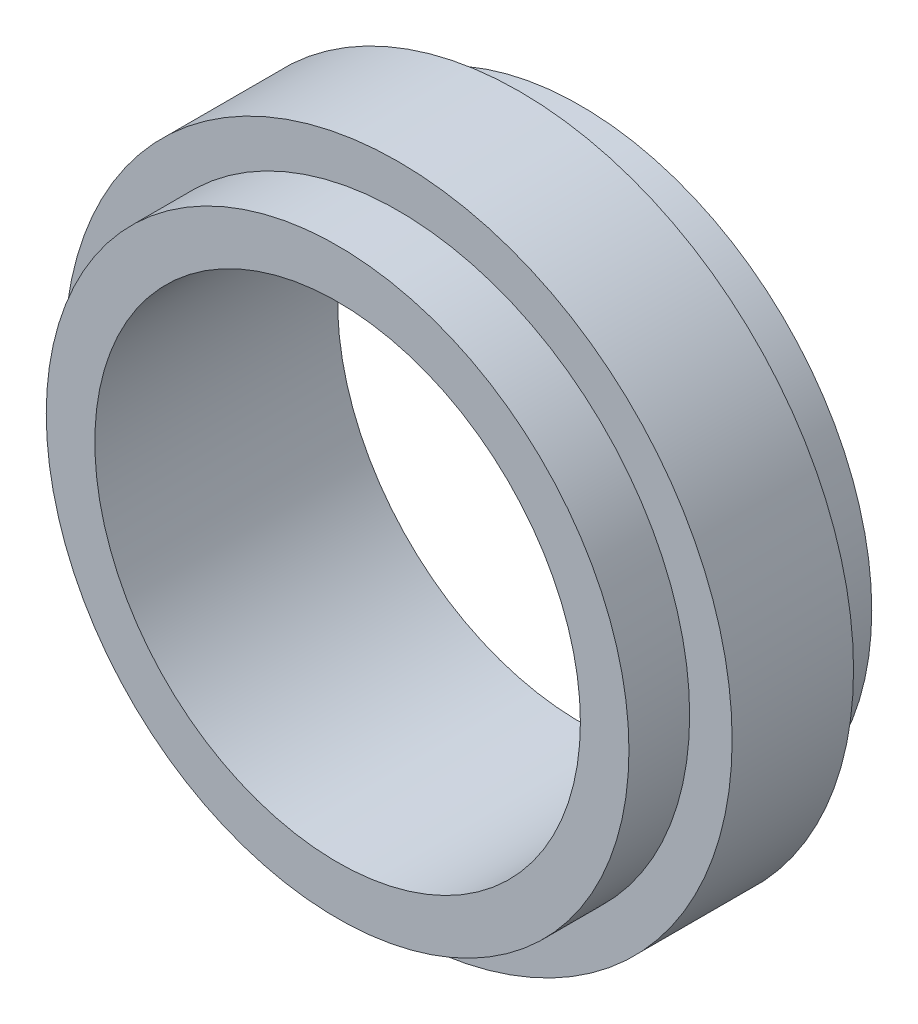
ISO-10303-21;
HEADER;
FILE_DESCRIPTION(('STEP AP214'),'2;1');
FILE_NAME('part.step','',(''),(''),'','','');
FILE_SCHEMA(('AUTOMOTIVE_DESIGN { 1 0 10303 214 1 1 1 1 }'));
ENDSEC;
DATA;
#1=APPLICATION_CONTEXT('core data for automotive mechanical design processes');
#2=APPLICATION_PROTOCOL_DEFINITION('international standard','automotive_design',2000,#1);
#3=PRODUCT_CONTEXT('',#1,'mechanical');
#4=PRODUCT('Part','Part','',(#3));
#5=PRODUCT_RELATED_PRODUCT_CATEGORY('part','',(#4));
#6=PRODUCT_DEFINITION_FORMATION('','',#4);
#7=PRODUCT_DEFINITION_CONTEXT('part definition',#1,'design');
#8=PRODUCT_DEFINITION('design','',#6,#7);
#9=PRODUCT_DEFINITION_SHAPE('','',#8);
#10=(LENGTH_UNIT() NAMED_UNIT(*) SI_UNIT(.MILLI.,.METRE.));
#11=(NAMED_UNIT(*) PLANE_ANGLE_UNIT() SI_UNIT($,.RADIAN.));
#12=(NAMED_UNIT(*) SI_UNIT($,.STERADIAN.) SOLID_ANGLE_UNIT());
#13=UNCERTAINTY_MEASURE_WITH_UNIT(LENGTH_MEASURE(1.E-05),#10,'distance_accuracy_value','');
#14=(GEOMETRIC_REPRESENTATION_CONTEXT(3) GLOBAL_UNCERTAINTY_ASSIGNED_CONTEXT((#13)) GLOBAL_UNIT_ASSIGNED_CONTEXT((#10,
#11,#12)) REPRESENTATION_CONTEXT('',''));
#15=CARTESIAN_POINT('',(0.,0.,0.));
#16=DIRECTION('',(0.,0.,1.));
#17=DIRECTION('',(1.,0.,0.));
#18=AXIS2_PLACEMENT_3D('',#15,#16,#17);
#19=CARTESIAN_POINT('',(0.,0.,5.));
#20=DIRECTION('',(0.,0.,1.));
#21=DIRECTION('',(1.,0.,0.));
#22=AXIS2_PLACEMENT_3D('',#19,#20,#21);
#23=PLANE('',#22);
#24=CARTESIAN_POINT('',(0.,0.,5.));
#25=DIRECTION('',(0.,0.,1.));
#26=DIRECTION('',(1.,0.,0.));
#27=AXIS2_PLACEMENT_3D('',#24,#25,#26);
#28=CIRCLE('',#27,27.5);
#29=CARTESIAN_POINT('',(27.5,0.,5.));
#30=VERTEX_POINT('',#29);
#31=EDGE_CURVE('E10',#30,#30,#28,.T.);
#32=ORIENTED_EDGE('',*,*,#31,.T.);
#33=EDGE_LOOP('',(#32));
#34=FACE_BOUND('',#33,.T.);
#35=CARTESIAN_POINT('',(0.,0.,5.));
#36=DIRECTION('',(0.,0.,1.));
#37=DIRECTION('',(1.,0.,0.));
#38=AXIS2_PLACEMENT_3D('',#35,#36,#37);
#39=CIRCLE('',#38,24.);
#40=CARTESIAN_POINT('',(24.,0.,5.));
#41=VERTEX_POINT('',#40);
#42=EDGE_CURVE('E47',#41,#41,#39,.T.);
#43=ORIENTED_EDGE('',*,*,#42,.F.);
#44=EDGE_LOOP('',(#43));
#45=FACE_BOUND('',#44,.T.);
#46=ADVANCED_FACE('F34',(#34,#45),#23,.T.);
#47=CARTESIAN_POINT('',(0.,0.,-5.));
#48=DIRECTION('',(0.,0.,1.));
#49=DIRECTION('',(1.,0.,0.));
#50=AXIS2_PLACEMENT_3D('',#47,#48,#49);
#51=PLANE('',#50);
#52=CARTESIAN_POINT('',(0.,0.,-5.));
#53=DIRECTION('',(0.,0.,1.));
#54=DIRECTION('',(1.,0.,0.));
#55=AXIS2_PLACEMENT_3D('',#52,#53,#54);
#56=CIRCLE('',#55,24.);
#57=CARTESIAN_POINT('',(24.,0.,-5.));
#58=VERTEX_POINT('',#57);
#59=EDGE_CURVE('E56',#58,#58,#56,.T.);
#60=ORIENTED_EDGE('',*,*,#59,.T.);
#61=EDGE_LOOP('',(#60));
#62=FACE_BOUND('',#61,.T.);
#63=CARTESIAN_POINT('',(0.,0.,-5.));
#64=DIRECTION('',(0.,0.,1.));
#65=DIRECTION('',(1.,0.,0.));
#66=AXIS2_PLACEMENT_3D('',#63,#64,#65);
#67=CIRCLE('',#66,27.5);
#68=CARTESIAN_POINT('',(27.5,0.,-5.));
#69=VERTEX_POINT('',#68);
#70=EDGE_CURVE('E38',#69,#69,#67,.T.);
#71=ORIENTED_EDGE('',*,*,#70,.F.);
#72=EDGE_LOOP('',(#71));
#73=FACE_BOUND('',#72,.T.);
#74=ADVANCED_FACE('F80',(#62,#73),#51,.F.);
#75=CARTESIAN_POINT('',(0.,0.,5.));
#76=DIRECTION('',(0.,0.,-1.));
#77=DIRECTION('',(-1.,0.,0.));
#78=AXIS2_PLACEMENT_3D('',#75,#76,#77);
#79=CYLINDRICAL_SURFACE('',#78,27.5);
#80=ORIENTED_EDGE('',*,*,#31,.F.);
#81=EDGE_LOOP('',(#80));
#82=FACE_BOUND('',#81,.T.);
#83=ORIENTED_EDGE('',*,*,#70,.T.);
#84=EDGE_LOOP('',(#83));
#85=FACE_BOUND('',#84,.T.);
#86=ADVANCED_FACE('F36',(#82,#85),#79,.T.);
#87=CARTESIAN_POINT('',(0.,0.,5.));
#88=DIRECTION('',(0.,0.,-1.));
#89=DIRECTION('',(-1.,0.,0.));
#90=AXIS2_PLACEMENT_3D('',#87,#88,#89);
#91=CYLINDRICAL_SURFACE('',#90,20.);
#92=CARTESIAN_POINT('',(0.,0.,10.));
#93=DIRECTION('',(0.,0.,1.));
#94=DIRECTION('',(1.,0.,0.));
#95=AXIS2_PLACEMENT_3D('',#92,#93,#94);
#96=CIRCLE('',#95,20.);
#97=CARTESIAN_POINT('',(20.,0.,10.));
#98=VERTEX_POINT('',#97);
#99=EDGE_CURVE('E50',#98,#98,#96,.T.);
#100=ORIENTED_EDGE('',*,*,#99,.T.);
#101=EDGE_LOOP('',(#100));
#102=FACE_BOUND('',#101,.T.);
#103=CARTESIAN_POINT('',(0.,0.,-10.));
#104=DIRECTION('',(0.,0.,1.));
#105=DIRECTION('',(1.,0.,0.));
#106=AXIS2_PLACEMENT_3D('',#103,#104,#105);
#107=CIRCLE('',#106,20.);
#108=CARTESIAN_POINT('',(20.,0.,-10.));
#109=VERTEX_POINT('',#108);
#110=EDGE_CURVE('E59',#109,#109,#107,.T.);
#111=ORIENTED_EDGE('',*,*,#110,.F.);
#112=EDGE_LOOP('',(#111));
#113=FACE_BOUND('',#112,.T.);
#114=ADVANCED_FACE('F68',(#102,#113),#91,.F.);
#115=CARTESIAN_POINT('',(0.,0.,10.));
#116=DIRECTION('',(0.,0.,1.));
#117=DIRECTION('',(1.,0.,0.));
#118=AXIS2_PLACEMENT_3D('',#115,#116,#117);
#119=PLANE('',#118);
#120=CARTESIAN_POINT('',(0.,0.,10.));
#121=DIRECTION('',(0.,0.,1.));
#122=DIRECTION('',(1.,0.,0.));
#123=AXIS2_PLACEMENT_3D('',#120,#121,#122);
#124=CIRCLE('',#123,24.);
#125=CARTESIAN_POINT('',(24.,0.,10.));
#126=VERTEX_POINT('',#125);
#127=EDGE_CURVE('E45',#126,#126,#124,.T.);
#128=ORIENTED_EDGE('',*,*,#127,.T.);
#129=EDGE_LOOP('',(#128));
#130=FACE_BOUND('',#129,.T.);
#131=ORIENTED_EDGE('',*,*,#99,.F.);
#132=EDGE_LOOP('',(#131));
#133=FACE_BOUND('',#132,.T.);
#134=ADVANCED_FACE('F70',(#130,#133),#119,.T.);
#135=CARTESIAN_POINT('',(0.,0.,10.));
#136=DIRECTION('',(0.,0.,-1.));
#137=DIRECTION('',(-1.,0.,0.));
#138=AXIS2_PLACEMENT_3D('',#135,#136,#137);
#139=CYLINDRICAL_SURFACE('',#138,24.);
#140=ORIENTED_EDGE('',*,*,#127,.F.);
#141=EDGE_LOOP('',(#140));
#142=FACE_BOUND('',#141,.T.);
#143=ORIENTED_EDGE('',*,*,#42,.T.);
#144=EDGE_LOOP('',(#143));
#145=FACE_BOUND('',#144,.T.);
#146=ADVANCED_FACE('F77',(#142,#145),#139,.T.);
#147=CARTESIAN_POINT('',(0.,0.,-10.));
#148=DIRECTION('',(0.,0.,1.));
#149=DIRECTION('',(1.,0.,0.));
#150=AXIS2_PLACEMENT_3D('',#147,#148,#149);
#151=CYLINDRICAL_SURFACE('',#150,24.);
#152=CARTESIAN_POINT('',(0.,0.,-10.));
#153=DIRECTION('',(0.,0.,1.));
#154=DIRECTION('',(1.,0.,0.));
#155=AXIS2_PLACEMENT_3D('',#152,#153,#154);
#156=CIRCLE('',#155,24.);
#157=CARTESIAN_POINT('',(24.,0.,-10.));
#158=VERTEX_POINT('',#157);
#159=EDGE_CURVE('E55',#158,#158,#156,.T.);
#160=ORIENTED_EDGE('',*,*,#159,.T.);
#161=EDGE_LOOP('',(#160));
#162=FACE_BOUND('',#161,.T.);
#163=ORIENTED_EDGE('',*,*,#59,.F.);
#164=EDGE_LOOP('',(#163));
#165=FACE_BOUND('',#164,.T.);
#166=ADVANCED_FACE('F93',(#162,#165),#151,.T.);
#167=CARTESIAN_POINT('',(0.,0.,-10.));
#168=DIRECTION('',(0.,0.,-1.));
#169=DIRECTION('',(1.,0.,0.));
#170=AXIS2_PLACEMENT_3D('',#167,#168,#169);
#171=PLANE('',#170);
#172=ORIENTED_EDGE('',*,*,#110,.T.);
#173=EDGE_LOOP('',(#172));
#174=FACE_BOUND('',#173,.T.);
#175=ORIENTED_EDGE('',*,*,#159,.F.);
#176=EDGE_LOOP('',(#175));
#177=FACE_BOUND('',#176,.T.);
#178=ADVANCED_FACE('F65',(#174,#177),#171,.T.);
#179=CLOSED_SHELL('',(#46,#74,#86,#114,#134,#146,#166,#178));
#180=MANIFOLD_SOLID_BREP('B2',#179);
#181=ADVANCED_BREP_SHAPE_REPRESENTATION('',(#18,#180),#14);
#182=SHAPE_DEFINITION_REPRESENTATION(#9,#181);
ENDSEC;
END-ISO-10303-21;
